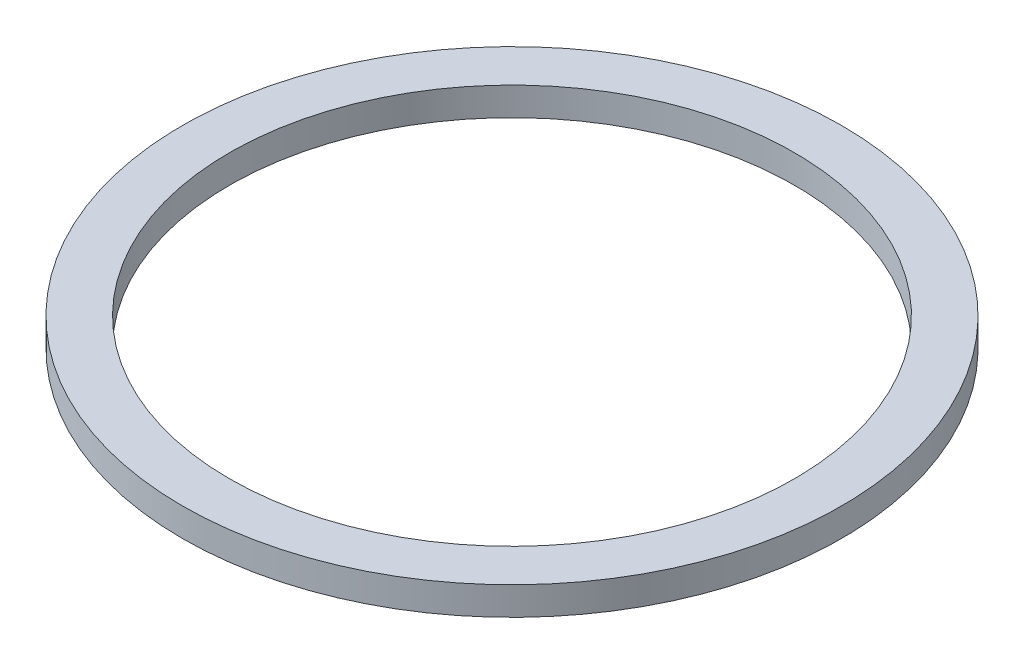
ISO-10303-21;
HEADER;
FILE_DESCRIPTION(('STEP AP214'),'2;1');
FILE_NAME('part.step','',(''),(''),'','','');
FILE_SCHEMA(('AUTOMOTIVE_DESIGN { 1 0 10303 214 1 1 1 1 }'));
ENDSEC;
DATA;
#1=APPLICATION_CONTEXT('core data for automotive mechanical design processes');
#2=APPLICATION_PROTOCOL_DEFINITION('international standard','automotive_design',2000,#1);
#3=PRODUCT_CONTEXT('',#1,'mechanical');
#4=PRODUCT('Part','Part','',(#3));
#5=PRODUCT_RELATED_PRODUCT_CATEGORY('part','',(#4));
#6=PRODUCT_DEFINITION_FORMATION('','',#4);
#7=PRODUCT_DEFINITION_CONTEXT('part definition',#1,'design');
#8=PRODUCT_DEFINITION('design','',#6,#7);
#9=PRODUCT_DEFINITION_SHAPE('','',#8);
#10=(LENGTH_UNIT() NAMED_UNIT(*) SI_UNIT(.MILLI.,.METRE.));
#11=(NAMED_UNIT(*) PLANE_ANGLE_UNIT() SI_UNIT($,.RADIAN.));
#12=(NAMED_UNIT(*) SI_UNIT($,.STERADIAN.) SOLID_ANGLE_UNIT());
#13=UNCERTAINTY_MEASURE_WITH_UNIT(LENGTH_MEASURE(1.E-05),#10,'distance_accuracy_value','');
#14=(GEOMETRIC_REPRESENTATION_CONTEXT(3) GLOBAL_UNCERTAINTY_ASSIGNED_CONTEXT((#13)) GLOBAL_UNIT_ASSIGNED_CONTEXT((#10,
#11,#12)) REPRESENTATION_CONTEXT('',''));
#15=CARTESIAN_POINT('',(0.,0.,0.));
#16=DIRECTION('',(0.,0.,1.));
#17=DIRECTION('',(1.,0.,0.));
#18=AXIS2_PLACEMENT_3D('',#15,#16,#17);
#19=CARTESIAN_POINT('',(0.,30.,0.));
#20=DIRECTION('',(0.,1.,0.));
#21=DIRECTION('',(0.,0.,1.));
#22=AXIS2_PLACEMENT_3D('',#19,#20,#21);
#23=PLANE('',#22);
#24=CARTESIAN_POINT('',(0.,30.,0.));
#25=DIRECTION('',(0.,1.,0.));
#26=DIRECTION('',(0.,0.,1.));
#27=AXIS2_PLACEMENT_3D('',#24,#25,#26);
#28=CIRCLE('',#27,350.);
#29=CARTESIAN_POINT('',(0.,30.,350.));
#30=VERTEX_POINT('',#29);
#31=EDGE_CURVE('E10',#30,#30,#28,.T.);
#32=ORIENTED_EDGE('',*,*,#31,.T.);
#33=EDGE_LOOP('',(#32));
#34=FACE_BOUND('',#33,.T.);
#35=CARTESIAN_POINT('',(0.,30.,0.));
#36=DIRECTION('',(0.,1.,0.));
#37=DIRECTION('',(0.,0.,1.));
#38=AXIS2_PLACEMENT_3D('',#35,#36,#37);
#39=CIRCLE('',#38,300.);
#40=CARTESIAN_POINT('',(0.,30.,300.));
#41=VERTEX_POINT('',#40);
#42=EDGE_CURVE('E58',#41,#41,#39,.T.);
#43=ORIENTED_EDGE('',*,*,#42,.F.);
#44=EDGE_LOOP('',(#43));
#45=FACE_BOUND('',#44,.T.);
#46=ADVANCED_FACE('F44',(#34,#45),#23,.T.);
#47=CARTESIAN_POINT('',(0.,0.,0.));
#48=DIRECTION('',(0.,1.,0.));
#49=DIRECTION('',(0.,0.,1.));
#50=AXIS2_PLACEMENT_3D('',#47,#48,#49);
#51=PLANE('',#50);
#52=CARTESIAN_POINT('',(0.,0.,0.));
#53=DIRECTION('',(0.,1.,0.));
#54=DIRECTION('',(0.,0.,1.));
#55=AXIS2_PLACEMENT_3D('',#52,#53,#54);
#56=CIRCLE('',#55,350.);
#57=CARTESIAN_POINT('',(0.,0.,350.));
#58=VERTEX_POINT('',#57);
#59=EDGE_CURVE('E48',#58,#58,#56,.T.);
#60=ORIENTED_EDGE('',*,*,#59,.F.);
#61=EDGE_LOOP('',(#60));
#62=FACE_BOUND('',#61,.T.);
#63=CARTESIAN_POINT('',(0.,0.,0.));
#64=DIRECTION('',(0.,1.,0.));
#65=DIRECTION('',(0.,0.,1.));
#66=AXIS2_PLACEMENT_3D('',#63,#64,#65);
#67=CIRCLE('',#66,300.);
#68=CARTESIAN_POINT('',(0.,0.,300.));
#69=VERTEX_POINT('',#68);
#70=EDGE_CURVE('E60',#69,#69,#67,.T.);
#71=ORIENTED_EDGE('',*,*,#70,.T.);
#72=EDGE_LOOP('',(#71));
#73=FACE_BOUND('',#72,.T.);
#74=ADVANCED_FACE('F71',(#62,#73),#51,.F.);
#75=CARTESIAN_POINT('',(0.,30.,0.));
#76=DIRECTION('',(0.,-1.,0.));
#77=DIRECTION('',(0.,0.,-1.));
#78=AXIS2_PLACEMENT_3D('',#75,#76,#77);
#79=CYLINDRICAL_SURFACE('',#78,350.);
#80=ORIENTED_EDGE('',*,*,#31,.F.);
#81=EDGE_LOOP('',(#80));
#82=FACE_BOUND('',#81,.T.);
#83=ORIENTED_EDGE('',*,*,#59,.T.);
#84=EDGE_LOOP('',(#83));
#85=FACE_BOUND('',#84,.T.);
#86=ADVANCED_FACE('F46',(#82,#85),#79,.T.);
#87=CARTESIAN_POINT('',(0.,30.,0.));
#88=DIRECTION('',(0.,-1.,0.));
#89=DIRECTION('',(0.,0.,-1.));
#90=AXIS2_PLACEMENT_3D('',#87,#88,#89);
#91=CYLINDRICAL_SURFACE('',#90,300.);
#92=ORIENTED_EDGE('',*,*,#42,.T.);
#93=EDGE_LOOP('',(#92));
#94=FACE_BOUND('',#93,.T.);
#95=ORIENTED_EDGE('',*,*,#70,.F.);
#96=EDGE_LOOP('',(#95));
#97=FACE_BOUND('',#96,.T.);
#98=ADVANCED_FACE('F67',(#94,#97),#91,.F.);
#99=CLOSED_SHELL('',(#46,#74,#86,#98));
#100=MANIFOLD_SOLID_BREP('B2',#99);
#101=ADVANCED_BREP_SHAPE_REPRESENTATION('',(#18,#100),#14);
#102=SHAPE_DEFINITION_REPRESENTATION(#9,#101);
ENDSEC;
END-ISO-10303-21;
